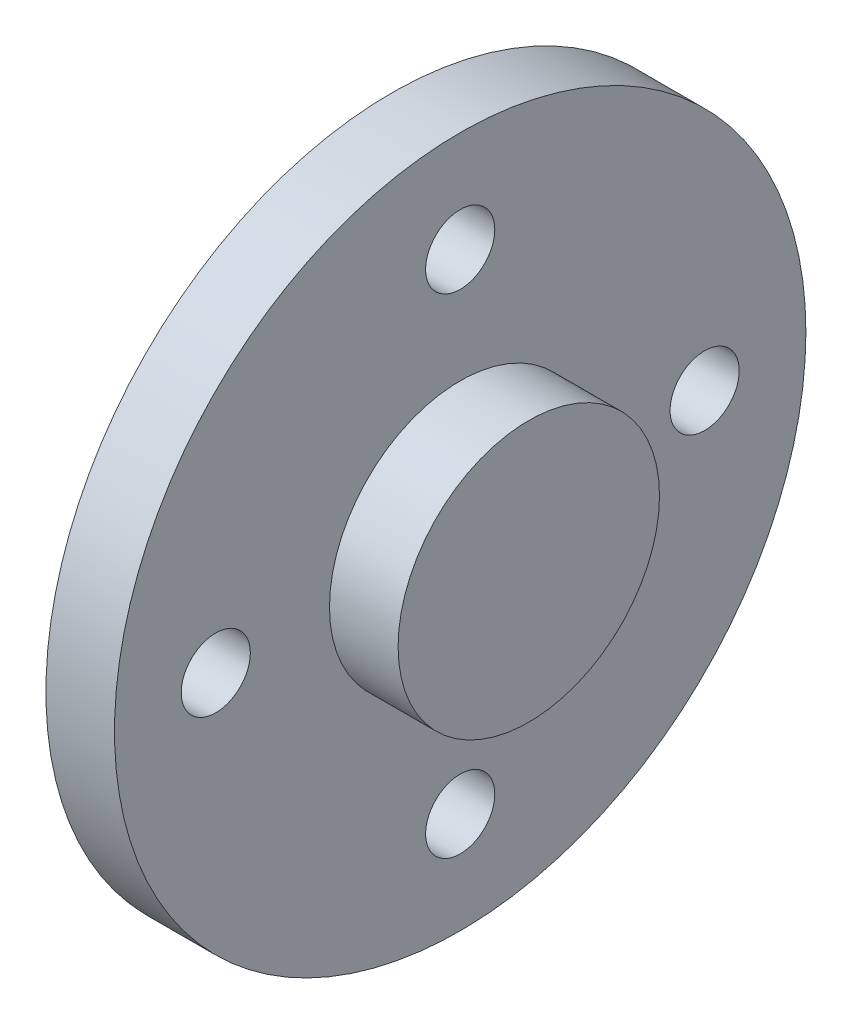
ISO-10303-21;
HEADER;
FILE_DESCRIPTION(('STEP AP214'),'2;1');
FILE_NAME('part.step','',(''),(''),'','','');
FILE_SCHEMA(('AUTOMOTIVE_DESIGN { 1 0 10303 214 1 1 1 1 }'));
ENDSEC;
DATA;
#1=APPLICATION_CONTEXT('core data for automotive mechanical design processes');
#2=APPLICATION_PROTOCOL_DEFINITION('international standard','automotive_design',2000,#1);
#3=PRODUCT_CONTEXT('',#1,'mechanical');
#4=PRODUCT('Part','Part','',(#3));
#5=PRODUCT_RELATED_PRODUCT_CATEGORY('part','',(#4));
#6=PRODUCT_DEFINITION_FORMATION('','',#4);
#7=PRODUCT_DEFINITION_CONTEXT('part definition',#1,'design');
#8=PRODUCT_DEFINITION('design','',#6,#7);
#9=PRODUCT_DEFINITION_SHAPE('','',#8);
#10=(LENGTH_UNIT() NAMED_UNIT(*) SI_UNIT(.MILLI.,.METRE.));
#11=(NAMED_UNIT(*) PLANE_ANGLE_UNIT() SI_UNIT($,.RADIAN.));
#12=(NAMED_UNIT(*) SI_UNIT($,.STERADIAN.) SOLID_ANGLE_UNIT());
#13=UNCERTAINTY_MEASURE_WITH_UNIT(LENGTH_MEASURE(1.E-05),#10,'distance_accuracy_value','');
#14=(GEOMETRIC_REPRESENTATION_CONTEXT(3) GLOBAL_UNCERTAINTY_ASSIGNED_CONTEXT((#13)) GLOBAL_UNIT_ASSIGNED_CONTEXT((#10,
#11,#12)) REPRESENTATION_CONTEXT('',''));
#15=CARTESIAN_POINT('',(0.,0.,0.));
#16=DIRECTION('',(0.,0.,1.));
#17=DIRECTION('',(1.,0.,0.));
#18=AXIS2_PLACEMENT_3D('',#15,#16,#17);
#19=CARTESIAN_POINT('',(3.175,-11.3137084989848,0.));
#20=DIRECTION('',(-1.,0.,0.));
#21=DIRECTION('',(0.,0.,1.));
#22=AXIS2_PLACEMENT_3D('',#19,#20,#21);
#23=CYLINDRICAL_SURFACE('',#22,1.6);
#24=CARTESIAN_POINT('',(3.175,-11.3137084989848,0.));
#25=DIRECTION('',(1.,0.,0.));
#26=DIRECTION('',(0.,0.,-1.));
#27=AXIS2_PLACEMENT_3D('',#24,#25,#26);
#28=CIRCLE('',#27,1.6);
#29=CARTESIAN_POINT('',(3.175,-11.3137084989848,-1.6));
#30=VERTEX_POINT('',#29);
#31=EDGE_CURVE('E41',#30,#30,#28,.T.);
#32=ORIENTED_EDGE('',*,*,#31,.T.);
#33=EDGE_LOOP('',(#32));
#34=FACE_BOUND('',#33,.T.);
#35=CARTESIAN_POINT('',(0.,-11.3137084989848,0.));
#36=DIRECTION('',(1.,0.,0.));
#37=DIRECTION('',(0.,0.,-1.));
#38=AXIS2_PLACEMENT_3D('',#35,#36,#37);
#39=CIRCLE('',#38,1.6);
#40=CARTESIAN_POINT('',(0.,-11.3137084989848,-1.6));
#41=VERTEX_POINT('',#40);
#42=EDGE_CURVE('E59',#41,#41,#39,.T.);
#43=ORIENTED_EDGE('',*,*,#42,.F.);
#44=EDGE_LOOP('',(#43));
#45=FACE_BOUND('',#44,.T.);
#46=ADVANCED_FACE('F33',(#34,#45),#23,.F.);
#47=CARTESIAN_POINT('',(3.175,0.,-11.3137084989848));
#48=DIRECTION('',(-1.,0.,0.));
#49=DIRECTION('',(0.,0.,1.));
#50=AXIS2_PLACEMENT_3D('',#47,#48,#49);
#51=CYLINDRICAL_SURFACE('',#50,1.6);
#52=CARTESIAN_POINT('',(3.175,0.,-11.3137084989848));
#53=DIRECTION('',(1.,0.,0.));
#54=DIRECTION('',(0.,0.,-1.));
#55=AXIS2_PLACEMENT_3D('',#52,#53,#54);
#56=CIRCLE('',#55,1.6);
#57=CARTESIAN_POINT('',(3.175,0.,-12.9137084989848));
#58=VERTEX_POINT('',#57);
#59=EDGE_CURVE('E46',#58,#58,#56,.T.);
#60=ORIENTED_EDGE('',*,*,#59,.T.);
#61=EDGE_LOOP('',(#60));
#62=FACE_BOUND('',#61,.T.);
#63=CARTESIAN_POINT('',(0.,0.,-11.3137084989848));
#64=DIRECTION('',(1.,0.,0.));
#65=DIRECTION('',(0.,0.,-1.));
#66=AXIS2_PLACEMENT_3D('',#63,#64,#65);
#67=CIRCLE('',#66,1.6);
#68=CARTESIAN_POINT('',(0.,0.,-12.9137084989848));
#69=VERTEX_POINT('',#68);
#70=EDGE_CURVE('E57',#69,#69,#67,.T.);
#71=ORIENTED_EDGE('',*,*,#70,.F.);
#72=EDGE_LOOP('',(#71));
#73=FACE_BOUND('',#72,.T.);
#74=ADVANCED_FACE('F80',(#62,#73),#51,.F.);
#75=CARTESIAN_POINT('',(3.175,11.3137084989848,0.));
#76=DIRECTION('',(-1.,0.,0.));
#77=DIRECTION('',(0.,0.,1.));
#78=AXIS2_PLACEMENT_3D('',#75,#76,#77);
#79=CYLINDRICAL_SURFACE('',#78,1.6);
#80=CARTESIAN_POINT('',(3.175,11.3137084989848,0.));
#81=DIRECTION('',(1.,0.,0.));
#82=DIRECTION('',(0.,0.,-1.));
#83=AXIS2_PLACEMENT_3D('',#80,#81,#82);
#84=CIRCLE('',#83,1.6);
#85=CARTESIAN_POINT('',(3.175,11.3137084989848,-1.6));
#86=VERTEX_POINT('',#85);
#87=EDGE_CURVE('E68',#86,#86,#84,.T.);
#88=ORIENTED_EDGE('',*,*,#87,.T.);
#89=EDGE_LOOP('',(#88));
#90=FACE_BOUND('',#89,.T.);
#91=CARTESIAN_POINT('',(0.,11.3137084989848,0.));
#92=DIRECTION('',(1.,0.,0.));
#93=DIRECTION('',(0.,0.,-1.));
#94=AXIS2_PLACEMENT_3D('',#91,#92,#93);
#95=CIRCLE('',#94,1.6);
#96=CARTESIAN_POINT('',(0.,11.3137084989848,-1.6));
#97=VERTEX_POINT('',#96);
#98=EDGE_CURVE('E53',#97,#97,#95,.T.);
#99=ORIENTED_EDGE('',*,*,#98,.F.);
#100=EDGE_LOOP('',(#99));
#101=FACE_BOUND('',#100,.T.);
#102=ADVANCED_FACE('F98',(#90,#101),#79,.F.);
#103=CARTESIAN_POINT('',(3.175,0.,11.3137084989848));
#104=DIRECTION('',(-1.,0.,0.));
#105=DIRECTION('',(0.,0.,1.));
#106=AXIS2_PLACEMENT_3D('',#103,#104,#105);
#107=CYLINDRICAL_SURFACE('',#106,1.6);
#108=CARTESIAN_POINT('',(3.175,0.,11.3137084989848));
#109=DIRECTION('',(1.,0.,0.));
#110=DIRECTION('',(0.,0.,-1.));
#111=AXIS2_PLACEMENT_3D('',#108,#109,#110);
#112=CIRCLE('',#111,1.6);
#113=CARTESIAN_POINT('',(3.175,0.,9.71370849898476));
#114=VERTEX_POINT('',#113);
#115=EDGE_CURVE('E64',#114,#114,#112,.T.);
#116=ORIENTED_EDGE('',*,*,#115,.T.);
#117=EDGE_LOOP('',(#116));
#118=FACE_BOUND('',#117,.T.);
#119=CARTESIAN_POINT('',(0.,0.,11.3137084989848));
#120=DIRECTION('',(1.,0.,0.));
#121=DIRECTION('',(0.,0.,-1.));
#122=AXIS2_PLACEMENT_3D('',#119,#120,#121);
#123=CIRCLE('',#122,1.6);
#124=CARTESIAN_POINT('',(0.,0.,9.71370849898476));
#125=VERTEX_POINT('',#124);
#126=EDGE_CURVE('E50',#125,#125,#123,.T.);
#127=ORIENTED_EDGE('',*,*,#126,.F.);
#128=EDGE_LOOP('',(#127));
#129=FACE_BOUND('',#128,.T.);
#130=ADVANCED_FACE('F35',(#118,#129),#107,.F.);
#131=CARTESIAN_POINT('',(3.175,0.,0.));
#132=DIRECTION('',(-1.,0.,0.));
#133=DIRECTION('',(0.,0.,1.));
#134=AXIS2_PLACEMENT_3D('',#131,#132,#133);
#135=CYLINDRICAL_SURFACE('',#134,16.);
#136=CARTESIAN_POINT('',(3.175,0.,0.));
#137=DIRECTION('',(1.,0.,0.));
#138=DIRECTION('',(0.,0.,-1.));
#139=AXIS2_PLACEMENT_3D('',#136,#137,#138);
#140=CIRCLE('',#139,16.);
#141=CARTESIAN_POINT('',(3.175,0.,-16.));
#142=VERTEX_POINT('',#141);
#143=EDGE_CURVE('E10',#142,#142,#140,.T.);
#144=ORIENTED_EDGE('',*,*,#143,.F.);
#145=EDGE_LOOP('',(#144));
#146=FACE_BOUND('',#145,.T.);
#147=CARTESIAN_POINT('',(0.,0.,0.));
#148=DIRECTION('',(1.,0.,0.));
#149=DIRECTION('',(0.,0.,-1.));
#150=AXIS2_PLACEMENT_3D('',#147,#148,#149);
#151=CIRCLE('',#150,16.);
#152=CARTESIAN_POINT('',(0.,0.,-16.));
#153=VERTEX_POINT('',#152);
#154=EDGE_CURVE('E37',#153,#153,#151,.T.);
#155=ORIENTED_EDGE('',*,*,#154,.T.);
#156=EDGE_LOOP('',(#155));
#157=FACE_BOUND('',#156,.T.);
#158=ADVANCED_FACE('F87',(#146,#157),#135,.T.);
#159=CARTESIAN_POINT('',(3.175,0.,0.));
#160=DIRECTION('',(1.,0.,0.));
#161=DIRECTION('',(0.,0.,-1.));
#162=AXIS2_PLACEMENT_3D('',#159,#160,#161);
#163=PLANE('',#162);
#164=CARTESIAN_POINT('',(3.175,0.,0.));
#165=DIRECTION('',(1.,0.,0.));
#166=DIRECTION('',(0.,0.,-1.));
#167=AXIS2_PLACEMENT_3D('',#164,#165,#166);
#168=CIRCLE('',#167,6.05);
#169=CARTESIAN_POINT('',(3.175,0.,-6.05));
#170=VERTEX_POINT('',#169);
#171=EDGE_CURVE('E75',#170,#170,#168,.T.);
#172=ORIENTED_EDGE('',*,*,#171,.F.);
#173=EDGE_LOOP('',(#172));
#174=FACE_BOUND('',#173,.T.);
#175=ORIENTED_EDGE('',*,*,#115,.F.);
#176=EDGE_LOOP('',(#175));
#177=FACE_BOUND('',#176,.T.);
#178=ORIENTED_EDGE('',*,*,#87,.F.);
#179=EDGE_LOOP('',(#178));
#180=FACE_BOUND('',#179,.T.);
#181=ORIENTED_EDGE('',*,*,#59,.F.);
#182=EDGE_LOOP('',(#181));
#183=FACE_BOUND('',#182,.T.);
#184=ORIENTED_EDGE('',*,*,#31,.F.);
#185=EDGE_LOOP('',(#184));
#186=FACE_BOUND('',#185,.T.);
#187=ORIENTED_EDGE('',*,*,#143,.T.);
#188=EDGE_LOOP('',(#187));
#189=FACE_BOUND('',#188,.T.);
#190=ADVANCED_FACE('F83',(#174,#177,#180,#183,#186,#189),#163,.T.);
#191=CARTESIAN_POINT('',(0.,0.,0.));
#192=DIRECTION('',(1.,0.,0.));
#193=DIRECTION('',(0.,0.,-1.));
#194=AXIS2_PLACEMENT_3D('',#191,#192,#193);
#195=PLANE('',#194);
#196=ORIENTED_EDGE('',*,*,#126,.T.);
#197=EDGE_LOOP('',(#196));
#198=FACE_BOUND('',#197,.T.);
#199=ORIENTED_EDGE('',*,*,#98,.T.);
#200=EDGE_LOOP('',(#199));
#201=FACE_BOUND('',#200,.T.);
#202=ORIENTED_EDGE('',*,*,#70,.T.);
#203=EDGE_LOOP('',(#202));
#204=FACE_BOUND('',#203,.T.);
#205=ORIENTED_EDGE('',*,*,#42,.T.);
#206=EDGE_LOOP('',(#205));
#207=FACE_BOUND('',#206,.T.);
#208=ORIENTED_EDGE('',*,*,#154,.F.);
#209=EDGE_LOOP('',(#208));
#210=FACE_BOUND('',#209,.T.);
#211=ADVANCED_FACE('F86',(#198,#201,#204,#207,#210),#195,.F.);
#212=CARTESIAN_POINT('',(6.35,0.,0.));
#213=DIRECTION('',(-1.,0.,0.));
#214=DIRECTION('',(0.,0.,1.));
#215=AXIS2_PLACEMENT_3D('',#212,#213,#214);
#216=CYLINDRICAL_SURFACE('',#215,6.05);
#217=CARTESIAN_POINT('',(6.35,0.,0.));
#218=DIRECTION('',(1.,0.,0.));
#219=DIRECTION('',(0.,0.,-1.));
#220=AXIS2_PLACEMENT_3D('',#217,#218,#219);
#221=CIRCLE('',#220,6.05);
#222=CARTESIAN_POINT('',(6.35,0.,-6.05));
#223=VERTEX_POINT('',#222);
#224=EDGE_CURVE('E54',#223,#223,#221,.T.);
#225=ORIENTED_EDGE('',*,*,#224,.F.);
#226=EDGE_LOOP('',(#225));
#227=FACE_BOUND('',#226,.T.);
#228=ORIENTED_EDGE('',*,*,#171,.T.);
#229=EDGE_LOOP('',(#228));
#230=FACE_BOUND('',#229,.T.);
#231=ADVANCED_FACE('F113',(#227,#230),#216,.T.);
#232=CARTESIAN_POINT('',(6.35,0.,0.));
#233=DIRECTION('',(1.,0.,0.));
#234=DIRECTION('',(0.,0.,-1.));
#235=AXIS2_PLACEMENT_3D('',#232,#233,#234);
#236=PLANE('',#235);
#237=ORIENTED_EDGE('',*,*,#224,.T.);
#238=EDGE_LOOP('',(#237));
#239=FACE_BOUND('',#238,.T.);
#240=ADVANCED_FACE('F120',(#239),#236,.T.);
#241=CLOSED_SHELL('',(#46,#74,#102,#130,#158,#190,#211,#231,#240));
#242=MANIFOLD_SOLID_BREP('B2',#241);
#243=ADVANCED_BREP_SHAPE_REPRESENTATION('',(#18,#242),#14);
#244=SHAPE_DEFINITION_REPRESENTATION(#9,#243);
ENDSEC;
END-ISO-10303-21;
